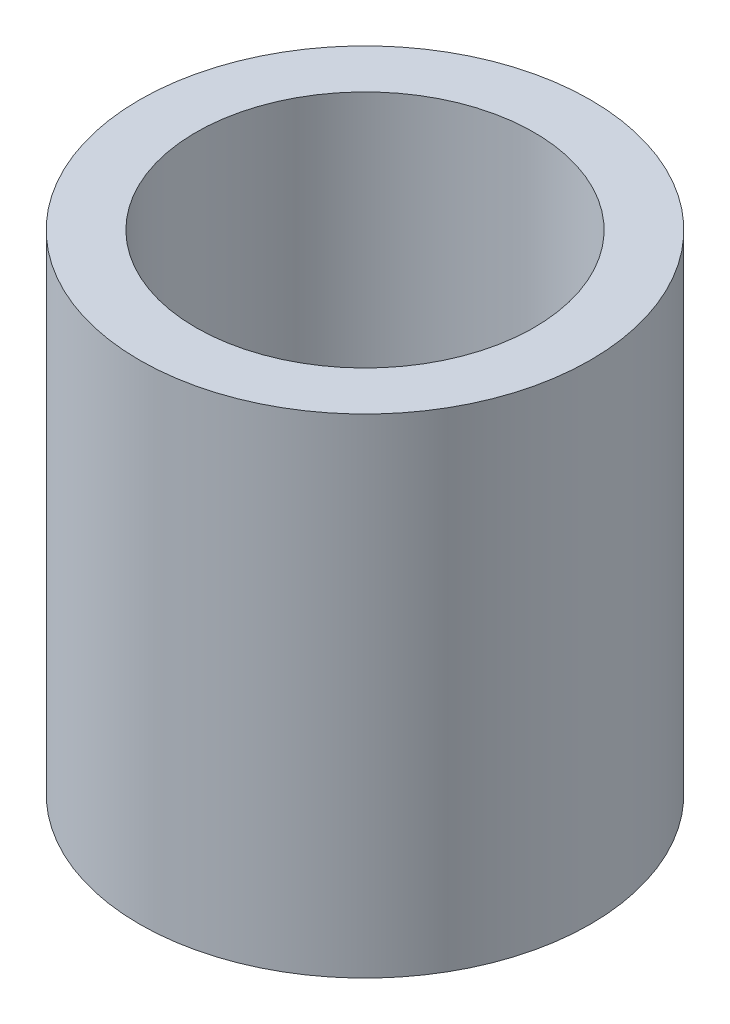
ISO-10303-21;
HEADER;
FILE_DESCRIPTION(('STEP AP214'),'2;1');
FILE_NAME('part.step','',(''),(''),'','','');
FILE_SCHEMA(('AUTOMOTIVE_DESIGN { 1 0 10303 214 1 1 1 1 }'));
ENDSEC;
DATA;
#1=APPLICATION_CONTEXT('core data for automotive mechanical design processes');
#2=APPLICATION_PROTOCOL_DEFINITION('international standard','automotive_design',2000,#1);
#3=PRODUCT_CONTEXT('',#1,'mechanical');
#4=PRODUCT('Part','Part','',(#3));
#5=PRODUCT_RELATED_PRODUCT_CATEGORY('part','',(#4));
#6=PRODUCT_DEFINITION_FORMATION('','',#4);
#7=PRODUCT_DEFINITION_CONTEXT('part definition',#1,'design');
#8=PRODUCT_DEFINITION('design','',#6,#7);
#9=PRODUCT_DEFINITION_SHAPE('','',#8);
#10=(LENGTH_UNIT() NAMED_UNIT(*) SI_UNIT(.MILLI.,.METRE.));
#11=(NAMED_UNIT(*) PLANE_ANGLE_UNIT() SI_UNIT($,.RADIAN.));
#12=(NAMED_UNIT(*) SI_UNIT($,.STERADIAN.) SOLID_ANGLE_UNIT());
#13=UNCERTAINTY_MEASURE_WITH_UNIT(LENGTH_MEASURE(1.E-05),#10,'distance_accuracy_value','');
#14=(GEOMETRIC_REPRESENTATION_CONTEXT(3) GLOBAL_UNCERTAINTY_ASSIGNED_CONTEXT((#13)) GLOBAL_UNIT_ASSIGNED_CONTEXT((#10,
#11,#12)) REPRESENTATION_CONTEXT('',''));
#15=CARTESIAN_POINT('',(0.,0.,0.));
#16=DIRECTION('',(0.,0.,1.));
#17=DIRECTION('',(1.,0.,0.));
#18=AXIS2_PLACEMENT_3D('',#15,#16,#17);
#19=CARTESIAN_POINT('',(-30.,11.7352813742386,0.));
#20=DIRECTION('',(0.,-1.,0.));
#21=DIRECTION('',(0.,0.,-1.));
#22=AXIS2_PLACEMENT_3D('',#19,#20,#21);
#23=CYLINDRICAL_SURFACE('',#22,3.);
#24=CARTESIAN_POINT('',(-30.,3.25,0.));
#25=DIRECTION('',(0.,1.,0.));
#26=DIRECTION('',(0.,0.,1.));
#27=AXIS2_PLACEMENT_3D('',#24,#25,#26);
#28=CIRCLE('',#27,3.);
#29=CARTESIAN_POINT('',(-30.,3.25,3.));
#30=VERTEX_POINT('',#29);
#31=EDGE_CURVE('E10',#30,#30,#28,.T.);
#32=ORIENTED_EDGE('',*,*,#31,.F.);
#33=EDGE_LOOP('',(#32));
#34=FACE_BOUND('',#33,.T.);
#35=CARTESIAN_POINT('',(-30.,-3.25,0.));
#36=DIRECTION('',(0.,1.,0.));
#37=DIRECTION('',(0.,0.,1.));
#38=AXIS2_PLACEMENT_3D('',#35,#36,#37);
#39=CIRCLE('',#38,3.);
#40=CARTESIAN_POINT('',(-30.,-3.25,3.));
#41=VERTEX_POINT('',#40);
#42=EDGE_CURVE('E39',#41,#41,#39,.F.);
#43=ORIENTED_EDGE('',*,*,#42,.F.);
#44=EDGE_LOOP('',(#43));
#45=FACE_BOUND('',#44,.T.);
#46=ADVANCED_FACE('F29',(#34,#45),#23,.T.);
#47=CARTESIAN_POINT('',(-30.,11.7352813742386,0.));
#48=DIRECTION('',(0.,-1.,0.));
#49=DIRECTION('',(0.,0.,-1.));
#50=AXIS2_PLACEMENT_3D('',#47,#48,#49);
#51=CYLINDRICAL_SURFACE('',#50,2.25000000000001);
#52=CARTESIAN_POINT('',(-30.,3.25,0.));
#53=DIRECTION('',(0.,1.,0.));
#54=DIRECTION('',(0.,0.,1.));
#55=AXIS2_PLACEMENT_3D('',#52,#53,#54);
#56=CIRCLE('',#55,2.25000000000001);
#57=CARTESIAN_POINT('',(-30.,3.25,2.25000000000001));
#58=VERTEX_POINT('',#57);
#59=EDGE_CURVE('E32',#58,#58,#56,.T.);
#60=ORIENTED_EDGE('',*,*,#59,.T.);
#61=EDGE_LOOP('',(#60));
#62=FACE_BOUND('',#61,.T.);
#63=CARTESIAN_POINT('',(-30.,-3.25,0.));
#64=DIRECTION('',(0.,1.,0.));
#65=DIRECTION('',(0.,0.,1.));
#66=AXIS2_PLACEMENT_3D('',#63,#64,#65);
#67=CIRCLE('',#66,2.25000000000001);
#68=CARTESIAN_POINT('',(-30.,-3.25,2.25000000000001));
#69=VERTEX_POINT('',#68);
#70=EDGE_CURVE('E41',#69,#69,#67,.F.);
#71=ORIENTED_EDGE('',*,*,#70,.T.);
#72=EDGE_LOOP('',(#71));
#73=FACE_BOUND('',#72,.T.);
#74=ADVANCED_FACE('F51',(#62,#73),#51,.F.);
#75=CARTESIAN_POINT('',(-30.,3.25,0.));
#76=DIRECTION('',(0.,1.,0.));
#77=DIRECTION('',(0.,0.,1.));
#78=AXIS2_PLACEMENT_3D('',#75,#76,#77);
#79=PLANE('',#78);
#80=ORIENTED_EDGE('',*,*,#59,.F.);
#81=EDGE_LOOP('',(#80));
#82=FACE_BOUND('',#81,.T.);
#83=ORIENTED_EDGE('',*,*,#31,.T.);
#84=EDGE_LOOP('',(#83));
#85=FACE_BOUND('',#84,.T.);
#86=ADVANCED_FACE('F56',(#82,#85),#79,.T.);
#87=CARTESIAN_POINT('',(-30.,-3.25,0.));
#88=DIRECTION('',(0.,1.,0.));
#89=DIRECTION('',(0.,0.,1.));
#90=AXIS2_PLACEMENT_3D('',#87,#88,#89);
#91=PLANE('',#90);
#92=ORIENTED_EDGE('',*,*,#42,.T.);
#93=EDGE_LOOP('',(#92));
#94=FACE_BOUND('',#93,.T.);
#95=ORIENTED_EDGE('',*,*,#70,.F.);
#96=EDGE_LOOP('',(#95));
#97=FACE_BOUND('',#96,.T.);
#98=ADVANCED_FACE('F47',(#94,#97),#91,.F.);
#99=CLOSED_SHELL('',(#46,#74,#86,#98));
#100=MANIFOLD_SOLID_BREP('B2',#99);
#101=ADVANCED_BREP_SHAPE_REPRESENTATION('',(#18,#100),#14);
#102=SHAPE_DEFINITION_REPRESENTATION(#9,#101);
ENDSEC;
END-ISO-10303-21;
